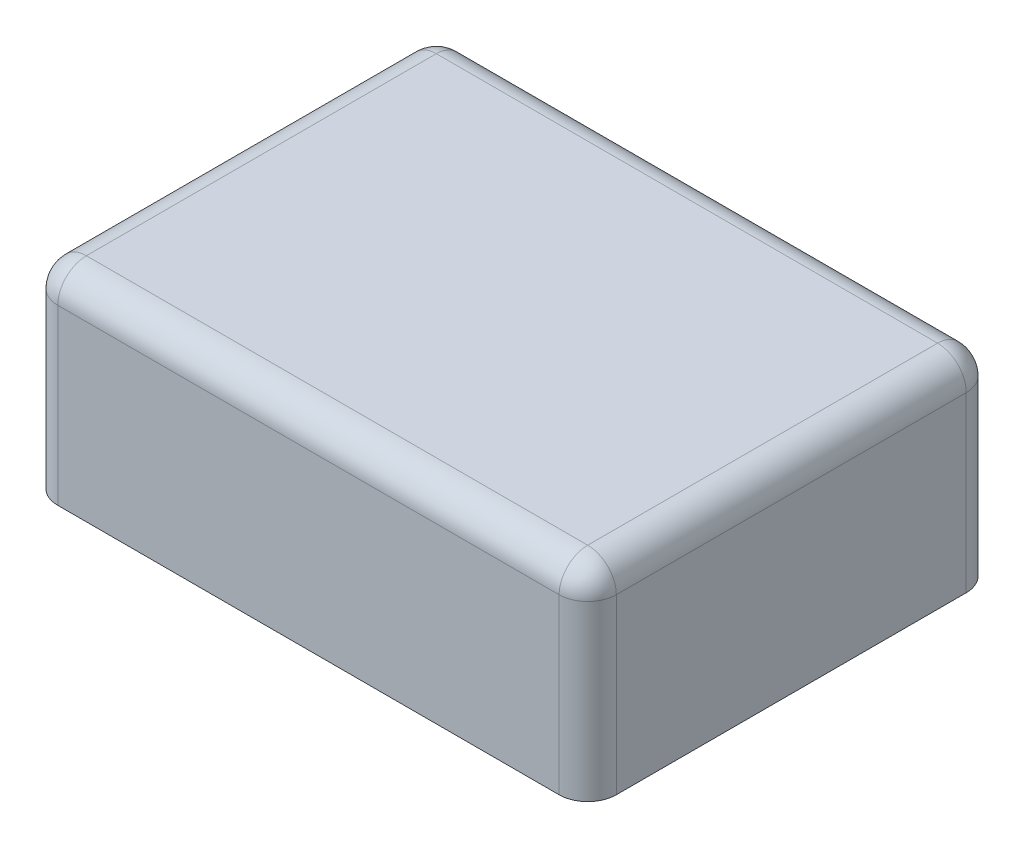
ISO-10303-21;
HEADER;
FILE_DESCRIPTION(('STEP AP214'),'2;1');
FILE_NAME('part.step','',(''),(''),'','','');
FILE_SCHEMA(('AUTOMOTIVE_DESIGN { 1 0 10303 214 1 1 1 1 }'));
ENDSEC;
DATA;
#1=APPLICATION_CONTEXT('core data for automotive mechanical design processes');
#2=APPLICATION_PROTOCOL_DEFINITION('international standard','automotive_design',2000,#1);
#3=PRODUCT_CONTEXT('',#1,'mechanical');
#4=PRODUCT('Part','Part','',(#3));
#5=PRODUCT_RELATED_PRODUCT_CATEGORY('part','',(#4));
#6=PRODUCT_DEFINITION_FORMATION('','',#4);
#7=PRODUCT_DEFINITION_CONTEXT('part definition',#1,'design');
#8=PRODUCT_DEFINITION('design','',#6,#7);
#9=PRODUCT_DEFINITION_SHAPE('','',#8);
#10=(LENGTH_UNIT() NAMED_UNIT(*) SI_UNIT(.MILLI.,.METRE.));
#11=(NAMED_UNIT(*) PLANE_ANGLE_UNIT() SI_UNIT($,.RADIAN.));
#12=(NAMED_UNIT(*) SI_UNIT($,.STERADIAN.) SOLID_ANGLE_UNIT());
#13=UNCERTAINTY_MEASURE_WITH_UNIT(LENGTH_MEASURE(1.E-05),#10,'distance_accuracy_value','');
#14=(GEOMETRIC_REPRESENTATION_CONTEXT(3) GLOBAL_UNCERTAINTY_ASSIGNED_CONTEXT((#13)) GLOBAL_UNIT_ASSIGNED_CONTEXT((#10,
#11,#12)) REPRESENTATION_CONTEXT('',''));
#15=CARTESIAN_POINT('',(0.,0.,0.));
#16=DIRECTION('',(0.,0.,1.));
#17=DIRECTION('',(1.,0.,0.));
#18=AXIS2_PLACEMENT_3D('',#15,#16,#17);
#19=CARTESIAN_POINT('',(0.888999999999997,15.24,-27.305));
#20=DIRECTION('',(0.,-1.,0.));
#21=DIRECTION('',(0.,0.,-1.));
#22=AXIS2_PLACEMENT_3D('',#19,#20,#21);
#23=CYLINDRICAL_SURFACE('',#22,0.889);
#24=DIRECTION('',(0.,-1.,0.));
#25=VECTOR('',#24,1.);
#26=CARTESIAN_POINT('',(0.889000000000003,15.24,-28.194));
#27=LINE('',#26,#25);
#28=CARTESIAN_POINT('',(0.889000000000003,13.97,-28.194));
#29=VERTEX_POINT('',#28);
#30=CARTESIAN_POINT('',(0.889000000000003,0.,-28.194));
#31=VERTEX_POINT('',#30);
#32=EDGE_CURVE('E181',#29,#31,#27,.T.);
#33=ORIENTED_EDGE('',*,*,#32,.F.);
#34=CARTESIAN_POINT('',(0.888999999999997,13.97,-27.305));
#35=DIRECTION('',(0.,1.,0.));
#36=DIRECTION('',(0.,0.,1.));
#37=AXIS2_PLACEMENT_3D('',#34,#35,#36);
#38=CIRCLE('',#37,0.889);
#39=CARTESIAN_POINT('',(0.,13.97,-27.305));
#40=VERTEX_POINT('',#39);
#41=EDGE_CURVE('E164',#29,#40,#38,.T.);
#42=ORIENTED_EDGE('',*,*,#41,.T.);
#43=DIRECTION('',(0.,-1.,0.));
#44=VECTOR('',#43,1.);
#45=CARTESIAN_POINT('',(0.,15.24,-27.305));
#46=LINE('',#45,#44);
#47=CARTESIAN_POINT('',(0.,0.,-27.305));
#48=VERTEX_POINT('',#47);
#49=EDGE_CURVE('E206',#40,#48,#46,.T.);
#50=ORIENTED_EDGE('',*,*,#49,.T.);
#51=CARTESIAN_POINT('',(0.888999999999997,0.,-27.305));
#52=DIRECTION('',(0.,1.,0.));
#53=DIRECTION('',(0.,0.,1.));
#54=AXIS2_PLACEMENT_3D('',#51,#52,#53);
#55=CIRCLE('',#54,0.889);
#56=EDGE_CURVE('E293',#31,#48,#55,.T.);
#57=ORIENTED_EDGE('',*,*,#56,.F.);
#58=EDGE_LOOP('',(#33,#42,#50,#57));
#59=FACE_BOUND('',#58,.T.);
#60=ADVANCED_FACE('F33',(#59),#23,.F.);
#61=CARTESIAN_POINT('',(0.,15.24,-28.194));
#62=DIRECTION('',(0.,0.,1.));
#63=DIRECTION('',(1.,0.,0.));
#64=AXIS2_PLACEMENT_3D('',#61,#62,#63);
#65=PLANE('',#64);
#66=DIRECTION('',(0.,-1.,0.));
#67=VECTOR('',#66,1.);
#68=CARTESIAN_POINT('',(38.735,15.24,-28.194));
#69=LINE('',#68,#67);
#70=CARTESIAN_POINT('',(38.735,13.97,-28.194));
#71=VERTEX_POINT('',#70);
#72=CARTESIAN_POINT('',(38.735,0.,-28.194));
#73=VERTEX_POINT('',#72);
#74=EDGE_CURVE('E173',#71,#73,#69,.T.);
#75=ORIENTED_EDGE('',*,*,#74,.F.);
#76=DIRECTION('',(-1.,0.,0.));
#77=VECTOR('',#76,1.);
#78=CARTESIAN_POINT('',(38.735,13.97,-28.194));
#79=LINE('',#78,#77);
#80=EDGE_CURVE('E158',#71,#29,#79,.T.);
#81=ORIENTED_EDGE('',*,*,#80,.T.);
#82=ORIENTED_EDGE('',*,*,#32,.T.);
#83=DIRECTION('',(-1.,0.,0.));
#84=VECTOR('',#83,1.);
#85=CARTESIAN_POINT('',(0.,0.,-28.194));
#86=LINE('',#85,#84);
#87=EDGE_CURVE('E179',#73,#31,#86,.T.);
#88=ORIENTED_EDGE('',*,*,#87,.F.);
#89=EDGE_LOOP('',(#75,#81,#82,#88));
#90=FACE_BOUND('',#89,.T.);
#91=ADVANCED_FACE('F177',(#90),#65,.T.);
#92=CARTESIAN_POINT('',(38.735,15.24,-27.305));
#93=DIRECTION('',(0.,-1.,0.));
#94=DIRECTION('',(0.,0.,-1.));
#95=AXIS2_PLACEMENT_3D('',#92,#93,#94);
#96=CYLINDRICAL_SURFACE('',#95,0.889000000000001);
#97=DIRECTION('',(0.,-1.,0.));
#98=VECTOR('',#97,1.);
#99=CARTESIAN_POINT('',(39.624,15.24,-27.305));
#100=LINE('',#99,#98);
#101=CARTESIAN_POINT('',(39.624,13.97,-27.305));
#102=VERTEX_POINT('',#101);
#103=CARTESIAN_POINT('',(39.624,0.,-27.305));
#104=VERTEX_POINT('',#103);
#105=EDGE_CURVE('E175',#102,#104,#100,.T.);
#106=ORIENTED_EDGE('',*,*,#105,.F.);
#107=CARTESIAN_POINT('',(38.735,13.97,-27.305));
#108=DIRECTION('',(0.,1.,0.));
#109=DIRECTION('',(0.,0.,1.));
#110=AXIS2_PLACEMENT_3D('',#107,#108,#109);
#111=CIRCLE('',#110,0.889000000000001);
#112=EDGE_CURVE('E161',#102,#71,#111,.T.);
#113=ORIENTED_EDGE('',*,*,#112,.T.);
#114=ORIENTED_EDGE('',*,*,#74,.T.);
#115=CARTESIAN_POINT('',(38.735,0.,-27.305));
#116=DIRECTION('',(0.,1.,0.));
#117=DIRECTION('',(0.,0.,1.));
#118=AXIS2_PLACEMENT_3D('',#115,#116,#117);
#119=CIRCLE('',#118,0.889000000000001);
#120=EDGE_CURVE('E297',#104,#73,#119,.T.);
#121=ORIENTED_EDGE('',*,*,#120,.F.);
#122=EDGE_LOOP('',(#106,#113,#114,#121));
#123=FACE_BOUND('',#122,.T.);
#124=ADVANCED_FACE('F171',(#123),#96,.F.);
#125=CARTESIAN_POINT('',(39.624,15.24,0.));
#126=DIRECTION('',(-1.,0.,0.));
#127=DIRECTION('',(0.,0.,1.));
#128=AXIS2_PLACEMENT_3D('',#125,#126,#127);
#129=PLANE('',#128);
#130=DIRECTION('',(0.,-1.,0.));
#131=VECTOR('',#130,1.);
#132=CARTESIAN_POINT('',(39.624,15.24,-0.889000000000006));
#133=LINE('',#132,#131);
#134=CARTESIAN_POINT('',(39.624,13.97,-0.889000000000006));
#135=VERTEX_POINT('',#134);
#136=CARTESIAN_POINT('',(39.624,0.,-0.889000000000006));
#137=VERTEX_POINT('',#136);
#138=EDGE_CURVE('E185',#135,#137,#133,.T.);
#139=ORIENTED_EDGE('',*,*,#138,.F.);
#140=DIRECTION('',(0.,0.,-1.));
#141=VECTOR('',#140,1.);
#142=CARTESIAN_POINT('',(39.624,13.97,-0.889000000000006));
#143=LINE('',#142,#141);
#144=EDGE_CURVE('E339',#135,#102,#143,.T.);
#145=ORIENTED_EDGE('',*,*,#144,.T.);
#146=ORIENTED_EDGE('',*,*,#105,.T.);
#147=DIRECTION('',(0.,0.,-1.));
#148=VECTOR('',#147,1.);
#149=CARTESIAN_POINT('',(39.624,0.,0.));
#150=LINE('',#149,#148);
#151=EDGE_CURVE('E299',#137,#104,#150,.T.);
#152=ORIENTED_EDGE('',*,*,#151,.F.);
#153=EDGE_LOOP('',(#139,#145,#146,#152));
#154=FACE_BOUND('',#153,.T.);
#155=ADVANCED_FACE('F328',(#154),#129,.T.);
#156=CARTESIAN_POINT('',(38.735,15.24,-0.889));
#157=DIRECTION('',(0.,-1.,0.));
#158=DIRECTION('',(0.,0.,-1.));
#159=AXIS2_PLACEMENT_3D('',#156,#157,#158);
#160=CYLINDRICAL_SURFACE('',#159,0.889);
#161=DIRECTION('',(0.,-1.,0.));
#162=VECTOR('',#161,1.);
#163=CARTESIAN_POINT('',(38.735,15.24,0.));
#164=LINE('',#163,#162);
#165=CARTESIAN_POINT('',(38.735,13.97,0.));
#166=VERTEX_POINT('',#165);
#167=CARTESIAN_POINT('',(38.735,0.,0.));
#168=VERTEX_POINT('',#167);
#169=EDGE_CURVE('E318',#166,#168,#164,.T.);
#170=ORIENTED_EDGE('',*,*,#169,.F.);
#171=CARTESIAN_POINT('',(38.735,13.97,-0.889));
#172=DIRECTION('',(0.,1.,0.));
#173=DIRECTION('',(0.,0.,1.));
#174=AXIS2_PLACEMENT_3D('',#171,#172,#173);
#175=CIRCLE('',#174,0.889000000000001);
#176=EDGE_CURVE('E326',#166,#135,#175,.T.);
#177=ORIENTED_EDGE('',*,*,#176,.T.);
#178=ORIENTED_EDGE('',*,*,#138,.T.);
#179=CARTESIAN_POINT('',(38.735,0.,-0.889));
#180=DIRECTION('',(0.,1.,0.));
#181=DIRECTION('',(0.,0.,1.));
#182=AXIS2_PLACEMENT_3D('',#179,#180,#181);
#183=CIRCLE('',#182,0.889);
#184=EDGE_CURVE('E302',#168,#137,#183,.T.);
#185=ORIENTED_EDGE('',*,*,#184,.F.);
#186=EDGE_LOOP('',(#170,#177,#178,#185));
#187=FACE_BOUND('',#186,.T.);
#188=ADVANCED_FACE('F325',(#187),#160,.F.);
#189=CARTESIAN_POINT('',(0.,15.24,0.));
#190=DIRECTION('',(0.,0.,-1.));
#191=DIRECTION('',(-1.,0.,0.));
#192=AXIS2_PLACEMENT_3D('',#189,#190,#191);
#193=PLANE('',#192);
#194=DIRECTION('',(0.,-1.,0.));
#195=VECTOR('',#194,1.);
#196=CARTESIAN_POINT('',(0.889000000000006,15.24,0.));
#197=LINE('',#196,#195);
#198=CARTESIAN_POINT('',(0.889000000000006,13.97,0.));
#199=VERTEX_POINT('',#198);
#200=CARTESIAN_POINT('',(0.889000000000006,0.,0.));
#201=VERTEX_POINT('',#200);
#202=EDGE_CURVE('E316',#199,#201,#197,.T.);
#203=ORIENTED_EDGE('',*,*,#202,.F.);
#204=DIRECTION('',(1.,0.,0.));
#205=VECTOR('',#204,1.);
#206=CARTESIAN_POINT('',(0.889000000000006,13.97,0.));
#207=LINE('',#206,#205);
#208=EDGE_CURVE('E335',#199,#166,#207,.T.);
#209=ORIENTED_EDGE('',*,*,#208,.T.);
#210=ORIENTED_EDGE('',*,*,#169,.T.);
#211=DIRECTION('',(1.,0.,0.));
#212=VECTOR('',#211,1.);
#213=CARTESIAN_POINT('',(0.,0.,0.));
#214=LINE('',#213,#212);
#215=EDGE_CURVE('E305',#201,#168,#214,.T.);
#216=ORIENTED_EDGE('',*,*,#215,.F.);
#217=EDGE_LOOP('',(#203,#209,#210,#216));
#218=FACE_BOUND('',#217,.T.);
#219=ADVANCED_FACE('F333',(#218),#193,.T.);
#220=CARTESIAN_POINT('',(0.889,15.24,-0.889));
#221=DIRECTION('',(0.,-1.,0.));
#222=DIRECTION('',(0.,0.,-1.));
#223=AXIS2_PLACEMENT_3D('',#220,#221,#222);
#224=CYLINDRICAL_SURFACE('',#223,0.889);
#225=CARTESIAN_POINT('',(0.889,13.97,-0.889));
#226=DIRECTION('',(0.,1.,0.));
#227=DIRECTION('',(0.,0.,1.));
#228=AXIS2_PLACEMENT_3D('',#225,#226,#227);
#229=CIRCLE('',#228,0.889);
#230=CARTESIAN_POINT('',(0.,13.97,-0.889000000000006));
#231=VERTEX_POINT('',#230);
#232=EDGE_CURVE('E337',#231,#199,#229,.T.);
#233=ORIENTED_EDGE('',*,*,#232,.T.);
#234=ORIENTED_EDGE('',*,*,#202,.T.);
#235=CARTESIAN_POINT('',(0.889,0.,-0.889));
#236=DIRECTION('',(0.,1.,0.));
#237=DIRECTION('',(0.,0.,1.));
#238=AXIS2_PLACEMENT_3D('',#235,#236,#237);
#239=CIRCLE('',#238,0.889);
#240=CARTESIAN_POINT('',(0.,0.,-0.889000000000006));
#241=VERTEX_POINT('',#240);
#242=EDGE_CURVE('E308',#201,#241,#239,.F.);
#243=ORIENTED_EDGE('',*,*,#242,.T.);
#244=DIRECTION('',(0.,-1.,0.));
#245=VECTOR('',#244,1.);
#246=CARTESIAN_POINT('',(0.,15.24,-0.889000000000006));
#247=LINE('',#246,#245);
#248=EDGE_CURVE('E314',#231,#241,#247,.T.);
#249=ORIENTED_EDGE('',*,*,#248,.F.);
#250=EDGE_LOOP('',(#233,#234,#243,#249));
#251=FACE_BOUND('',#250,.T.);
#252=ADVANCED_FACE('F537',(#251),#224,.F.);
#253=CARTESIAN_POINT('',(0.,15.24,0.));
#254=DIRECTION('',(1.,0.,0.));
#255=DIRECTION('',(0.,0.,-1.));
#256=AXIS2_PLACEMENT_3D('',#253,#254,#255);
#257=PLANE('',#256);
#258=ORIENTED_EDGE('',*,*,#49,.F.);
#259=DIRECTION('',(0.,0.,1.));
#260=VECTOR('',#259,1.);
#261=CARTESIAN_POINT('',(0.,13.97,-27.305));
#262=LINE('',#261,#260);
#263=EDGE_CURVE('E341',#40,#231,#262,.T.);
#264=ORIENTED_EDGE('',*,*,#263,.T.);
#265=ORIENTED_EDGE('',*,*,#248,.T.);
#266=DIRECTION('',(0.,0.,1.));
#267=VECTOR('',#266,1.);
#268=CARTESIAN_POINT('',(0.,0.,0.));
#269=LINE('',#268,#267);
#270=EDGE_CURVE('E192',#48,#241,#269,.T.);
#271=ORIENTED_EDGE('',*,*,#270,.F.);
#272=EDGE_LOOP('',(#258,#264,#265,#271));
#273=FACE_BOUND('',#272,.T.);
#274=ADVANCED_FACE('F545',(#273),#257,.T.);
#275=CARTESIAN_POINT('',(0.889,15.24,-27.305));
#276=DIRECTION('',(0.,-1.,0.));
#277=DIRECTION('',(0.,0.,-1.));
#278=AXIS2_PLACEMENT_3D('',#275,#276,#277);
#279=CYLINDRICAL_SURFACE('',#278,2.159);
#280=DIRECTION('',(0.,-1.,0.));
#281=VECTOR('',#280,1.);
#282=CARTESIAN_POINT('',(-1.27,15.24,-27.305));
#283=LINE('',#282,#281);
#284=CARTESIAN_POINT('',(-1.27,13.081,-27.305));
#285=VERTEX_POINT('',#284);
#286=CARTESIAN_POINT('',(-1.27,0.,-27.305));
#287=VERTEX_POINT('',#286);
#288=EDGE_CURVE('E204',#285,#287,#283,.T.);
#289=ORIENTED_EDGE('',*,*,#288,.F.);
#290=CARTESIAN_POINT('',(0.889,13.081,-27.305));
#291=DIRECTION('',(0.,-1.,0.));
#292=DIRECTION('',(0.,0.,-1.));
#293=AXIS2_PLACEMENT_3D('',#290,#291,#292);
#294=CIRCLE('',#293,2.159);
#295=CARTESIAN_POINT('',(0.889000000000014,13.081,-29.464));
#296=VERTEX_POINT('',#295);
#297=EDGE_CURVE('E11',#285,#296,#294,.T.);
#298=ORIENTED_EDGE('',*,*,#297,.T.);
#299=DIRECTION('',(0.,-1.,0.));
#300=VECTOR('',#299,1.);
#301=CARTESIAN_POINT('',(0.889000000000014,15.24,-29.464));
#302=LINE('',#301,#300);
#303=CARTESIAN_POINT('',(0.889000000000014,0.,-29.464));
#304=VERTEX_POINT('',#303);
#305=EDGE_CURVE('E189',#296,#304,#302,.T.);
#306=ORIENTED_EDGE('',*,*,#305,.T.);
#307=CARTESIAN_POINT('',(0.889,0.,-27.305));
#308=DIRECTION('',(0.,1.,0.));
#309=DIRECTION('',(0.,0.,1.));
#310=AXIS2_PLACEMENT_3D('',#307,#308,#309);
#311=CIRCLE('',#310,2.159);
#312=EDGE_CURVE('E346',#287,#304,#311,.F.);
#313=ORIENTED_EDGE('',*,*,#312,.F.);
#314=EDGE_LOOP('',(#289,#298,#306,#313));
#315=FACE_BOUND('',#314,.T.);
#316=ADVANCED_FACE('F351',(#315),#279,.T.);
#317=CARTESIAN_POINT('',(-1.27,15.24,0.));
#318=DIRECTION('',(1.,0.,0.));
#319=DIRECTION('',(0.,0.,-1.));
#320=AXIS2_PLACEMENT_3D('',#317,#318,#319);
#321=PLANE('',#320);
#322=DIRECTION('',(0.,-1.,0.));
#323=VECTOR('',#322,1.);
#324=CARTESIAN_POINT('',(-1.27,15.24,-0.889000000000015));
#325=LINE('',#324,#323);
#326=CARTESIAN_POINT('',(-1.27,13.081,-0.889000000000015));
#327=VERTEX_POINT('',#326);
#328=CARTESIAN_POINT('',(-1.27,0.,-0.889000000000015));
#329=VERTEX_POINT('',#328);
#330=EDGE_CURVE('E202',#327,#329,#325,.T.);
#331=ORIENTED_EDGE('',*,*,#330,.F.);
#332=DIRECTION('',(0.,0.,1.));
#333=VECTOR('',#332,1.);
#334=CARTESIAN_POINT('',(-1.27,13.081,-27.305));
#335=LINE('',#334,#333);
#336=EDGE_CURVE('E42',#327,#285,#335,.F.);
#337=ORIENTED_EDGE('',*,*,#336,.T.);
#338=ORIENTED_EDGE('',*,*,#288,.T.);
#339=DIRECTION('',(0.,0.,1.));
#340=VECTOR('',#339,1.);
#341=CARTESIAN_POINT('',(-1.27,0.,0.));
#342=LINE('',#341,#340);
#343=EDGE_CURVE('E271',#287,#329,#342,.T.);
#344=ORIENTED_EDGE('',*,*,#343,.T.);
#345=EDGE_LOOP('',(#331,#337,#338,#344));
#346=FACE_BOUND('',#345,.T.);
#347=ADVANCED_FACE('F347',(#346),#321,.F.);
#348=CARTESIAN_POINT('',(0.889000000000003,15.24,-0.889));
#349=DIRECTION('',(0.,-1.,0.));
#350=DIRECTION('',(0.,0.,-1.));
#351=AXIS2_PLACEMENT_3D('',#348,#349,#350);
#352=CYLINDRICAL_SURFACE('',#351,2.159);
#353=DIRECTION('',(0.,-1.,0.));
#354=VECTOR('',#353,1.);
#355=CARTESIAN_POINT('',(0.889000000000019,15.24,1.27));
#356=LINE('',#355,#354);
#357=CARTESIAN_POINT('',(0.889000000000019,13.081,1.27));
#358=VERTEX_POINT('',#357);
#359=CARTESIAN_POINT('',(0.889000000000019,0.,1.27));
#360=VERTEX_POINT('',#359);
#361=EDGE_CURVE('E200',#358,#360,#356,.T.);
#362=ORIENTED_EDGE('',*,*,#361,.F.);
#363=CARTESIAN_POINT('',(0.889000000000003,13.081,-0.889));
#364=DIRECTION('',(0.,-1.,0.));
#365=DIRECTION('',(0.,0.,-1.));
#366=AXIS2_PLACEMENT_3D('',#363,#364,#365);
#367=CIRCLE('',#366,2.159);
#368=EDGE_CURVE('E57',#358,#327,#367,.T.);
#369=ORIENTED_EDGE('',*,*,#368,.T.);
#370=ORIENTED_EDGE('',*,*,#330,.T.);
#371=CARTESIAN_POINT('',(0.889000000000003,0.,-0.889));
#372=DIRECTION('',(0.,1.,0.));
#373=DIRECTION('',(0.,0.,1.));
#374=AXIS2_PLACEMENT_3D('',#371,#372,#373);
#375=CIRCLE('',#374,2.159);
#376=EDGE_CURVE('E265',#329,#360,#375,.T.);
#377=ORIENTED_EDGE('',*,*,#376,.T.);
#378=EDGE_LOOP('',(#362,#369,#370,#377));
#379=FACE_BOUND('',#378,.T.);
#380=ADVANCED_FACE('F263',(#379),#352,.T.);
#381=CARTESIAN_POINT('',(0.,15.24,1.27));
#382=DIRECTION('',(0.,0.,-1.));
#383=DIRECTION('',(-1.,0.,0.));
#384=AXIS2_PLACEMENT_3D('',#381,#382,#383);
#385=PLANE('',#384);
#386=DIRECTION('',(0.,-1.,0.));
#387=VECTOR('',#386,1.);
#388=CARTESIAN_POINT('',(38.735,15.24,1.27));
#389=LINE('',#388,#387);
#390=CARTESIAN_POINT('',(38.735,13.081,1.27));
#391=VERTEX_POINT('',#390);
#392=CARTESIAN_POINT('',(38.735,0.,1.27));
#393=VERTEX_POINT('',#392);
#394=EDGE_CURVE('E198',#391,#393,#389,.T.);
#395=ORIENTED_EDGE('',*,*,#394,.F.);
#396=DIRECTION('',(1.,0.,0.));
#397=VECTOR('',#396,1.);
#398=CARTESIAN_POINT('',(0.889000000000019,13.081,1.27));
#399=LINE('',#398,#397);
#400=EDGE_CURVE('E224',#391,#358,#399,.F.);
#401=ORIENTED_EDGE('',*,*,#400,.T.);
#402=ORIENTED_EDGE('',*,*,#361,.T.);
#403=DIRECTION('',(1.,0.,0.));
#404=VECTOR('',#403,1.);
#405=CARTESIAN_POINT('',(0.,0.,1.27));
#406=LINE('',#405,#404);
#407=EDGE_CURVE('E270',#360,#393,#406,.T.);
#408=ORIENTED_EDGE('',*,*,#407,.T.);
#409=EDGE_LOOP('',(#395,#401,#402,#408));
#410=FACE_BOUND('',#409,.T.);
#411=ADVANCED_FACE('F260',(#410),#385,.F.);
#412=CARTESIAN_POINT('',(38.735,15.24,-0.889));
#413=DIRECTION('',(0.,-1.,0.));
#414=DIRECTION('',(0.,0.,-1.));
#415=AXIS2_PLACEMENT_3D('',#412,#413,#414);
#416=CYLINDRICAL_SURFACE('',#415,2.159);
#417=DIRECTION('',(0.,-1.,0.));
#418=VECTOR('',#417,1.);
#419=CARTESIAN_POINT('',(40.894,15.24,-0.889000000000015));
#420=LINE('',#419,#418);
#421=CARTESIAN_POINT('',(40.894,13.081,-0.889000000000015));
#422=VERTEX_POINT('',#421);
#423=CARTESIAN_POINT('',(40.894,0.,-0.889000000000015));
#424=VERTEX_POINT('',#423);
#425=EDGE_CURVE('E196',#422,#424,#420,.T.);
#426=ORIENTED_EDGE('',*,*,#425,.F.);
#427=CARTESIAN_POINT('',(38.735,13.081,-0.889));
#428=DIRECTION('',(0.,-1.,0.));
#429=DIRECTION('',(0.,0.,-1.));
#430=AXIS2_PLACEMENT_3D('',#427,#428,#429);
#431=CIRCLE('',#430,2.159);
#432=EDGE_CURVE('E222',#422,#391,#431,.T.);
#433=ORIENTED_EDGE('',*,*,#432,.T.);
#434=ORIENTED_EDGE('',*,*,#394,.T.);
#435=CARTESIAN_POINT('',(38.735,0.,-0.889));
#436=DIRECTION('',(0.,1.,0.));
#437=DIRECTION('',(0.,0.,1.));
#438=AXIS2_PLACEMENT_3D('',#435,#436,#437);
#439=CIRCLE('',#438,2.159);
#440=EDGE_CURVE('E279',#393,#424,#439,.T.);
#441=ORIENTED_EDGE('',*,*,#440,.T.);
#442=EDGE_LOOP('',(#426,#433,#434,#441));
#443=FACE_BOUND('',#442,.T.);
#444=ADVANCED_FACE('F369',(#443),#416,.T.);
#445=CARTESIAN_POINT('',(40.894,15.24,0.));
#446=DIRECTION('',(-1.,0.,0.));
#447=DIRECTION('',(0.,0.,1.));
#448=AXIS2_PLACEMENT_3D('',#445,#446,#447);
#449=PLANE('',#448);
#450=DIRECTION('',(0.,-1.,0.));
#451=VECTOR('',#450,1.);
#452=CARTESIAN_POINT('',(40.894,15.24,-27.305));
#453=LINE('',#452,#451);
#454=CARTESIAN_POINT('',(40.894,13.081,-27.305));
#455=VERTEX_POINT('',#454);
#456=CARTESIAN_POINT('',(40.894,0.,-27.305));
#457=VERTEX_POINT('',#456);
#458=EDGE_CURVE('E194',#455,#457,#453,.T.);
#459=ORIENTED_EDGE('',*,*,#458,.F.);
#460=DIRECTION('',(0.,0.,-1.));
#461=VECTOR('',#460,1.);
#462=CARTESIAN_POINT('',(40.894,13.081,-0.889000000000015));
#463=LINE('',#462,#461);
#464=EDGE_CURVE('E220',#455,#422,#463,.F.);
#465=ORIENTED_EDGE('',*,*,#464,.T.);
#466=ORIENTED_EDGE('',*,*,#425,.T.);
#467=DIRECTION('',(0.,0.,-1.));
#468=VECTOR('',#467,1.);
#469=CARTESIAN_POINT('',(40.894,0.,0.));
#470=LINE('',#469,#468);
#471=EDGE_CURVE('E281',#424,#457,#470,.T.);
#472=ORIENTED_EDGE('',*,*,#471,.T.);
#473=EDGE_LOOP('',(#459,#465,#466,#472));
#474=FACE_BOUND('',#473,.T.);
#475=ADVANCED_FACE('F366',(#474),#449,.F.);
#476=CARTESIAN_POINT('',(38.735,15.24,-27.305));
#477=DIRECTION('',(0.,-1.,0.));
#478=DIRECTION('',(0.,0.,-1.));
#479=AXIS2_PLACEMENT_3D('',#476,#477,#478);
#480=CYLINDRICAL_SURFACE('',#479,2.159);
#481=DIRECTION('',(0.,-1.,0.));
#482=VECTOR('',#481,1.);
#483=CARTESIAN_POINT('',(38.735,15.24,-29.464));
#484=LINE('',#483,#482);
#485=CARTESIAN_POINT('',(38.735,13.081,-29.464));
#486=VERTEX_POINT('',#485);
#487=CARTESIAN_POINT('',(38.735,0.,-29.464));
#488=VERTEX_POINT('',#487);
#489=EDGE_CURVE('E191',#486,#488,#484,.T.);
#490=ORIENTED_EDGE('',*,*,#489,.F.);
#491=CARTESIAN_POINT('',(38.735,13.081,-27.305));
#492=DIRECTION('',(0.,-1.,0.));
#493=DIRECTION('',(0.,0.,-1.));
#494=AXIS2_PLACEMENT_3D('',#491,#492,#493);
#495=CIRCLE('',#494,2.159);
#496=EDGE_CURVE('E218',#486,#455,#495,.T.);
#497=ORIENTED_EDGE('',*,*,#496,.T.);
#498=ORIENTED_EDGE('',*,*,#458,.T.);
#499=CARTESIAN_POINT('',(38.735,0.,-27.305));
#500=DIRECTION('',(0.,1.,0.));
#501=DIRECTION('',(0.,0.,1.));
#502=AXIS2_PLACEMENT_3D('',#499,#500,#501);
#503=CIRCLE('',#502,2.159);
#504=EDGE_CURVE('E287',#457,#488,#503,.T.);
#505=ORIENTED_EDGE('',*,*,#504,.T.);
#506=EDGE_LOOP('',(#490,#497,#498,#505));
#507=FACE_BOUND('',#506,.T.);
#508=ADVANCED_FACE('F361',(#507),#480,.T.);
#509=CARTESIAN_POINT('',(0.,15.24,-29.464));
#510=DIRECTION('',(0.,0.,1.));
#511=DIRECTION('',(1.,0.,0.));
#512=AXIS2_PLACEMENT_3D('',#509,#510,#511);
#513=PLANE('',#512);
#514=ORIENTED_EDGE('',*,*,#305,.F.);
#515=DIRECTION('',(-1.,0.,0.));
#516=VECTOR('',#515,1.);
#517=CARTESIAN_POINT('',(38.735,13.081,-29.464));
#518=LINE('',#517,#516);
#519=EDGE_CURVE('E215',#296,#486,#518,.F.);
#520=ORIENTED_EDGE('',*,*,#519,.T.);
#521=ORIENTED_EDGE('',*,*,#489,.T.);
#522=DIRECTION('',(-1.,0.,0.));
#523=VECTOR('',#522,1.);
#524=CARTESIAN_POINT('',(0.,0.,-29.464));
#525=LINE('',#524,#523);
#526=EDGE_CURVE('E290',#488,#304,#525,.T.);
#527=ORIENTED_EDGE('',*,*,#526,.T.);
#528=EDGE_LOOP('',(#514,#520,#521,#527));
#529=FACE_BOUND('',#528,.T.);
#530=ADVANCED_FACE('F357',(#529),#513,.F.);
#531=CARTESIAN_POINT('',(0.,15.24,0.));
#532=DIRECTION('',(0.,1.,0.));
#533=DIRECTION('',(0.,0.,1.));
#534=AXIS2_PLACEMENT_3D('',#531,#532,#533);
#535=PLANE('',#534);
#536=DIRECTION('',(0.,0.,-1.));
#537=VECTOR('',#536,1.);
#538=CARTESIAN_POINT('',(38.735,15.24,-27.305));
#539=LINE('',#538,#537);
#540=CARTESIAN_POINT('',(38.735,15.24,-0.888999999999999));
#541=VERTEX_POINT('',#540);
#542=CARTESIAN_POINT('',(38.735,15.24,-27.305));
#543=VERTEX_POINT('',#542);
#544=EDGE_CURVE('E210',#541,#543,#539,.T.);
#545=ORIENTED_EDGE('',*,*,#544,.T.);
#546=DIRECTION('',(-1.,0.,0.));
#547=VECTOR('',#546,1.);
#548=CARTESIAN_POINT('',(0.889000000000015,15.24,-27.305));
#549=LINE('',#548,#547);
#550=CARTESIAN_POINT('',(0.889,15.24,-27.305));
#551=VERTEX_POINT('',#550);
#552=EDGE_CURVE('E212',#543,#551,#549,.T.);
#553=ORIENTED_EDGE('',*,*,#552,.T.);
#554=DIRECTION('',(0.,0.,1.));
#555=VECTOR('',#554,1.);
#556=CARTESIAN_POINT('',(0.889000000000003,15.24,-0.889000000000015));
#557=LINE('',#556,#555);
#558=CARTESIAN_POINT('',(0.889000000000003,15.24,-0.889));
#559=VERTEX_POINT('',#558);
#560=EDGE_CURVE('E183',#551,#559,#557,.T.);
#561=ORIENTED_EDGE('',*,*,#560,.T.);
#562=DIRECTION('',(1.,0.,0.));
#563=VECTOR('',#562,1.);
#564=CARTESIAN_POINT('',(38.735,15.24,-0.888999999999999));
#565=LINE('',#564,#563);
#566=EDGE_CURVE('E208',#559,#541,#565,.T.);
#567=ORIENTED_EDGE('',*,*,#566,.T.);
#568=EDGE_LOOP('',(#545,#553,#561,#567));
#569=FACE_BOUND('',#568,.T.);
#570=ADVANCED_FACE('F389',(#569),#535,.T.);
#571=CARTESIAN_POINT('',(0.,0.,0.));
#572=DIRECTION('',(0.,1.,0.));
#573=DIRECTION('',(0.,0.,1.));
#574=AXIS2_PLACEMENT_3D('',#571,#572,#573);
#575=PLANE('',#574);
#576=ORIENTED_EDGE('',*,*,#312,.T.);
#577=ORIENTED_EDGE('',*,*,#526,.F.);
#578=ORIENTED_EDGE('',*,*,#504,.F.);
#579=ORIENTED_EDGE('',*,*,#471,.F.);
#580=ORIENTED_EDGE('',*,*,#440,.F.);
#581=ORIENTED_EDGE('',*,*,#407,.F.);
#582=ORIENTED_EDGE('',*,*,#376,.F.);
#583=ORIENTED_EDGE('',*,*,#343,.F.);
#584=EDGE_LOOP('',(#576,#577,#578,#579,#580,#581,#582,#583));
#585=FACE_BOUND('',#584,.T.);
#586=ORIENTED_EDGE('',*,*,#56,.T.);
#587=ORIENTED_EDGE('',*,*,#270,.T.);
#588=ORIENTED_EDGE('',*,*,#242,.F.);
#589=ORIENTED_EDGE('',*,*,#215,.T.);
#590=ORIENTED_EDGE('',*,*,#184,.T.);
#591=ORIENTED_EDGE('',*,*,#151,.T.);
#592=ORIENTED_EDGE('',*,*,#120,.T.);
#593=ORIENTED_EDGE('',*,*,#87,.T.);
#594=EDGE_LOOP('',(#586,#587,#588,#589,#590,#591,#592,#593));
#595=FACE_BOUND('',#594,.T.);
#596=ADVANCED_FACE('F275',(#585,#595),#575,.F.);
#597=CARTESIAN_POINT('',(38.735,13.97,-27.305));
#598=DIRECTION('',(0.,1.,0.));
#599=DIRECTION('',(0.,0.,1.));
#600=AXIS2_PLACEMENT_3D('',#597,#598,#599);
#601=PLANE('',#600);
#602=ORIENTED_EDGE('',*,*,#112,.F.);
#603=ORIENTED_EDGE('',*,*,#144,.F.);
#604=ORIENTED_EDGE('',*,*,#176,.F.);
#605=ORIENTED_EDGE('',*,*,#208,.F.);
#606=ORIENTED_EDGE('',*,*,#232,.F.);
#607=ORIENTED_EDGE('',*,*,#263,.F.);
#608=ORIENTED_EDGE('',*,*,#41,.F.);
#609=ORIENTED_EDGE('',*,*,#80,.F.);
#610=EDGE_LOOP('',(#602,#603,#604,#605,#606,#607,#608,#609));
#611=FACE_BOUND('',#610,.T.);
#612=ADVANCED_FACE('F160',(#611),#601,.F.);
#613=CARTESIAN_POINT('',(0.,13.081,-0.888999999999999));
#614=DIRECTION('',(-1.,0.,0.));
#615=DIRECTION('',(0.,0.,1.));
#616=AXIS2_PLACEMENT_3D('',#613,#614,#615);
#617=CYLINDRICAL_SURFACE('',#616,2.159);
#618=CARTESIAN_POINT('',(0.889000000000019,13.081,-0.889));
#619=DIRECTION('',(-1.,0.,0.));
#620=DIRECTION('',(0.,0.,1.));
#621=AXIS2_PLACEMENT_3D('',#618,#619,#620);
#622=CIRCLE('',#621,2.159);
#623=EDGE_CURVE('E243',#358,#559,#622,.T.);
#624=ORIENTED_EDGE('',*,*,#623,.F.);
#625=ORIENTED_EDGE('',*,*,#400,.F.);
#626=CARTESIAN_POINT('',(38.735,13.081,-0.888999999999999));
#627=DIRECTION('',(1.,0.,0.));
#628=DIRECTION('',(0.,0.,-1.));
#629=AXIS2_PLACEMENT_3D('',#626,#627,#628);
#630=CIRCLE('',#629,2.159);
#631=EDGE_CURVE('E37',#541,#391,#630,.T.);
#632=ORIENTED_EDGE('',*,*,#631,.F.);
#633=ORIENTED_EDGE('',*,*,#566,.F.);
#634=EDGE_LOOP('',(#624,#625,#632,#633));
#635=FACE_BOUND('',#634,.T.);
#636=ADVANCED_FACE('F35',(#635),#617,.T.);
#637=CARTESIAN_POINT('',(38.735,13.081,-0.889));
#638=DIRECTION('',(0.,0.,1.));
#639=DIRECTION('',(1.,0.,0.));
#640=AXIS2_PLACEMENT_3D('',#637,#638,#639);
#641=SPHERICAL_SURFACE('',#640,2.159);
#642=ORIENTED_EDGE('',*,*,#631,.T.);
#643=ORIENTED_EDGE('',*,*,#432,.F.);
#644=CARTESIAN_POINT('',(38.735,13.081,-0.889));
#645=DIRECTION('',(0.,0.,-1.));
#646=DIRECTION('',(-1.,0.,0.));
#647=AXIS2_PLACEMENT_3D('',#644,#645,#646);
#648=CIRCLE('',#647,2.159);
#649=EDGE_CURVE('E241',#541,#422,#648,.T.);
#650=ORIENTED_EDGE('',*,*,#649,.F.);
#651=EDGE_LOOP('',(#642,#643,#650));
#652=FACE_BOUND('',#651,.T.);
#653=ADVANCED_FACE('F253',(#652),#641,.T.);
#654=CARTESIAN_POINT('',(0.889000000000003,13.081,-0.889));
#655=DIRECTION('',(0.,0.,1.));
#656=DIRECTION('',(1.,0.,0.));
#657=AXIS2_PLACEMENT_3D('',#654,#655,#656);
#658=SPHERICAL_SURFACE('',#657,2.159);
#659=ORIENTED_EDGE('',*,*,#368,.F.);
#660=ORIENTED_EDGE('',*,*,#623,.T.);
#661=CARTESIAN_POINT('',(0.889000000000003,13.081,-0.889));
#662=DIRECTION('',(0.,0.,-1.));
#663=DIRECTION('',(-1.,0.,0.));
#664=AXIS2_PLACEMENT_3D('',#661,#662,#663);
#665=CIRCLE('',#664,2.159);
#666=EDGE_CURVE('E238',#327,#559,#665,.T.);
#667=ORIENTED_EDGE('',*,*,#666,.F.);
#668=EDGE_LOOP('',(#659,#660,#667));
#669=FACE_BOUND('',#668,.T.);
#670=ADVANCED_FACE('F431',(#669),#658,.T.);
#671=CARTESIAN_POINT('',(38.735,13.081,0.));
#672=DIRECTION('',(0.,0.,1.));
#673=DIRECTION('',(1.,0.,0.));
#674=AXIS2_PLACEMENT_3D('',#671,#672,#673);
#675=CYLINDRICAL_SURFACE('',#674,2.159);
#676=ORIENTED_EDGE('',*,*,#649,.T.);
#677=ORIENTED_EDGE('',*,*,#464,.F.);
#678=CARTESIAN_POINT('',(38.735,13.081,-27.305));
#679=DIRECTION('',(0.,0.,-1.));
#680=DIRECTION('',(-1.,0.,0.));
#681=AXIS2_PLACEMENT_3D('',#678,#679,#680);
#682=CIRCLE('',#681,2.159);
#683=EDGE_CURVE('E235',#543,#455,#682,.T.);
#684=ORIENTED_EDGE('',*,*,#683,.F.);
#685=ORIENTED_EDGE('',*,*,#544,.F.);
#686=EDGE_LOOP('',(#676,#677,#684,#685));
#687=FACE_BOUND('',#686,.T.);
#688=ADVANCED_FACE('F437',(#687),#675,.T.);
#689=CARTESIAN_POINT('',(0.889000000000003,13.081,0.));
#690=DIRECTION('',(0.,0.,-1.));
#691=DIRECTION('',(-1.,0.,0.));
#692=AXIS2_PLACEMENT_3D('',#689,#690,#691);
#693=CYLINDRICAL_SURFACE('',#692,2.159);
#694=ORIENTED_EDGE('',*,*,#666,.T.);
#695=ORIENTED_EDGE('',*,*,#560,.F.);
#696=CARTESIAN_POINT('',(0.889,13.081,-27.305));
#697=DIRECTION('',(0.,0.,-1.));
#698=DIRECTION('',(-1.,0.,0.));
#699=AXIS2_PLACEMENT_3D('',#696,#697,#698);
#700=CIRCLE('',#699,2.159);
#701=EDGE_CURVE('E232',#285,#551,#700,.T.);
#702=ORIENTED_EDGE('',*,*,#701,.F.);
#703=ORIENTED_EDGE('',*,*,#336,.F.);
#704=EDGE_LOOP('',(#694,#695,#702,#703));
#705=FACE_BOUND('',#704,.T.);
#706=ADVANCED_FACE('F444',(#705),#693,.T.);
#707=CARTESIAN_POINT('',(38.735,13.081,-27.305));
#708=DIRECTION('',(0.,0.,1.));
#709=DIRECTION('',(1.,0.,0.));
#710=AXIS2_PLACEMENT_3D('',#707,#708,#709);
#711=SPHERICAL_SURFACE('',#710,2.159);
#712=ORIENTED_EDGE('',*,*,#683,.T.);
#713=ORIENTED_EDGE('',*,*,#496,.F.);
#714=CARTESIAN_POINT('',(38.735,13.081,-27.305));
#715=DIRECTION('',(-1.,0.,0.));
#716=DIRECTION('',(0.,0.,1.));
#717=AXIS2_PLACEMENT_3D('',#714,#715,#716);
#718=CIRCLE('',#717,2.159);
#719=EDGE_CURVE('E230',#543,#486,#718,.T.);
#720=ORIENTED_EDGE('',*,*,#719,.F.);
#721=EDGE_LOOP('',(#712,#713,#720));
#722=FACE_BOUND('',#721,.T.);
#723=ADVANCED_FACE('F452',(#722),#711,.T.);
#724=CARTESIAN_POINT('',(0.889,13.081,-27.305));
#725=DIRECTION('',(0.,0.,1.));
#726=DIRECTION('',(1.,0.,0.));
#727=AXIS2_PLACEMENT_3D('',#724,#725,#726);
#728=SPHERICAL_SURFACE('',#727,2.159);
#729=ORIENTED_EDGE('',*,*,#297,.F.);
#730=ORIENTED_EDGE('',*,*,#701,.T.);
#731=CARTESIAN_POINT('',(0.889,13.081,-27.305));
#732=DIRECTION('',(1.,0.,0.));
#733=DIRECTION('',(0.,0.,-1.));
#734=AXIS2_PLACEMENT_3D('',#731,#732,#733);
#735=CIRCLE('',#734,2.159);
#736=EDGE_CURVE('E228',#296,#551,#735,.T.);
#737=ORIENTED_EDGE('',*,*,#736,.F.);
#738=EDGE_LOOP('',(#729,#730,#737));
#739=FACE_BOUND('',#738,.T.);
#740=ADVANCED_FACE('F460',(#739),#728,.T.);
#741=CARTESIAN_POINT('',(0.,13.081,-27.305));
#742=DIRECTION('',(1.,0.,0.));
#743=DIRECTION('',(0.,0.,-1.));
#744=AXIS2_PLACEMENT_3D('',#741,#742,#743);
#745=CYLINDRICAL_SURFACE('',#744,2.159);
#746=ORIENTED_EDGE('',*,*,#719,.T.);
#747=ORIENTED_EDGE('',*,*,#519,.F.);
#748=ORIENTED_EDGE('',*,*,#736,.T.);
#749=ORIENTED_EDGE('',*,*,#552,.F.);
#750=EDGE_LOOP('',(#746,#747,#748,#749));
#751=FACE_BOUND('',#750,.T.);
#752=ADVANCED_FACE('F468',(#751),#745,.T.);
#753=CLOSED_SHELL('',(#60,#91,#124,#155,#188,#219,#252,#274,#316,#347,#380,#411,#444,#475,#508,
#530,#570,#596,#612,#636,#653,#670,#688,#706,#723,#740,#752));
#754=MANIFOLD_SOLID_BREP('B2',#753);
#755=ADVANCED_BREP_SHAPE_REPRESENTATION('',(#18,#754),#14);
#756=SHAPE_DEFINITION_REPRESENTATION(#9,#755);
ENDSEC;
END-ISO-10303-21;
